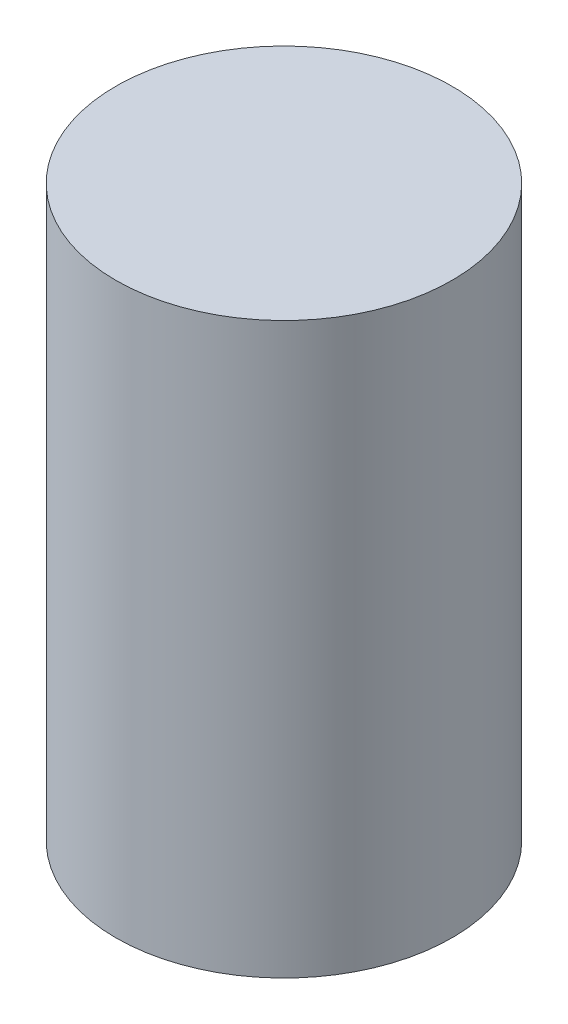
ISO-10303-21;
HEADER;
FILE_DESCRIPTION(('STEP AP214'),'2;1');
FILE_NAME('part.step','',(''),(''),'','','');
FILE_SCHEMA(('AUTOMOTIVE_DESIGN { 1 0 10303 214 1 1 1 1 }'));
ENDSEC;
DATA;
#1=APPLICATION_CONTEXT('core data for automotive mechanical design processes');
#2=APPLICATION_PROTOCOL_DEFINITION('international standard','automotive_design',2000,#1);
#3=PRODUCT_CONTEXT('',#1,'mechanical');
#4=PRODUCT('Part','Part','',(#3));
#5=PRODUCT_RELATED_PRODUCT_CATEGORY('part','',(#4));
#6=PRODUCT_DEFINITION_FORMATION('','',#4);
#7=PRODUCT_DEFINITION_CONTEXT('part definition',#1,'design');
#8=PRODUCT_DEFINITION('design','',#6,#7);
#9=PRODUCT_DEFINITION_SHAPE('','',#8);
#10=(LENGTH_UNIT() NAMED_UNIT(*) SI_UNIT(.MILLI.,.METRE.));
#11=(NAMED_UNIT(*) PLANE_ANGLE_UNIT() SI_UNIT($,.RADIAN.));
#12=(NAMED_UNIT(*) SI_UNIT($,.STERADIAN.) SOLID_ANGLE_UNIT());
#13=UNCERTAINTY_MEASURE_WITH_UNIT(LENGTH_MEASURE(1.E-05),#10,'distance_accuracy_value','');
#14=(GEOMETRIC_REPRESENTATION_CONTEXT(3) GLOBAL_UNCERTAINTY_ASSIGNED_CONTEXT((#13)) GLOBAL_UNIT_ASSIGNED_CONTEXT((#10,
#11,#12)) REPRESENTATION_CONTEXT('',''));
#15=CARTESIAN_POINT('',(0.,0.,0.));
#16=DIRECTION('',(0.,0.,1.));
#17=DIRECTION('',(1.,0.,0.));
#18=AXIS2_PLACEMENT_3D('',#15,#16,#17);
#19=CARTESIAN_POINT('',(0.,25.4,0.));
#20=DIRECTION('',(0.,-1.,0.));
#21=DIRECTION('',(0.,0.,-1.));
#22=AXIS2_PLACEMENT_3D('',#19,#20,#21);
#23=CYLINDRICAL_SURFACE('',#22,7.5);
#24=CARTESIAN_POINT('',(0.,25.4,0.));
#25=DIRECTION('',(0.,1.,0.));
#26=DIRECTION('',(0.,0.,1.));
#27=AXIS2_PLACEMENT_3D('',#24,#25,#26);
#28=CIRCLE('',#27,7.5);
#29=CARTESIAN_POINT('',(0.,25.4,7.5));
#30=VERTEX_POINT('',#29);
#31=EDGE_CURVE('E10',#30,#30,#28,.T.);
#32=ORIENTED_EDGE('',*,*,#31,.F.);
#33=EDGE_LOOP('',(#32));
#34=FACE_BOUND('',#33,.T.);
#35=CARTESIAN_POINT('',(0.,0.,0.));
#36=DIRECTION('',(0.,1.,0.));
#37=DIRECTION('',(0.,0.,1.));
#38=AXIS2_PLACEMENT_3D('',#35,#36,#37);
#39=CIRCLE('',#38,7.5);
#40=CARTESIAN_POINT('',(0.,0.,7.5));
#41=VERTEX_POINT('',#40);
#42=EDGE_CURVE('E46',#41,#41,#39,.T.);
#43=ORIENTED_EDGE('',*,*,#42,.T.);
#44=EDGE_LOOP('',(#43));
#45=FACE_BOUND('',#44,.T.);
#46=ADVANCED_FACE('F43',(#34,#45),#23,.T.);
#47=CARTESIAN_POINT('',(0.,25.4,0.));
#48=DIRECTION('',(0.,1.,0.));
#49=DIRECTION('',(0.,0.,1.));
#50=AXIS2_PLACEMENT_3D('',#47,#48,#49);
#51=PLANE('',#50);
#52=ORIENTED_EDGE('',*,*,#31,.T.);
#53=EDGE_LOOP('',(#52));
#54=FACE_BOUND('',#53,.T.);
#55=ADVANCED_FACE('F60',(#54),#51,.T.);
#56=CARTESIAN_POINT('',(0.,0.,0.));
#57=DIRECTION('',(0.,1.,0.));
#58=DIRECTION('',(0.,0.,1.));
#59=AXIS2_PLACEMENT_3D('',#56,#57,#58);
#60=PLANE('',#59);
#61=ORIENTED_EDGE('',*,*,#42,.F.);
#62=EDGE_LOOP('',(#61));
#63=FACE_BOUND('',#62,.T.);
#64=ADVANCED_FACE('F58',(#63),#60,.F.);
#65=CLOSED_SHELL('',(#46,#55,#64));
#66=MANIFOLD_SOLID_BREP('B2',#65);
#67=ADVANCED_BREP_SHAPE_REPRESENTATION('',(#18,#66),#14);
#68=SHAPE_DEFINITION_REPRESENTATION(#9,#67);
ENDSEC;
END-ISO-10303-21;
